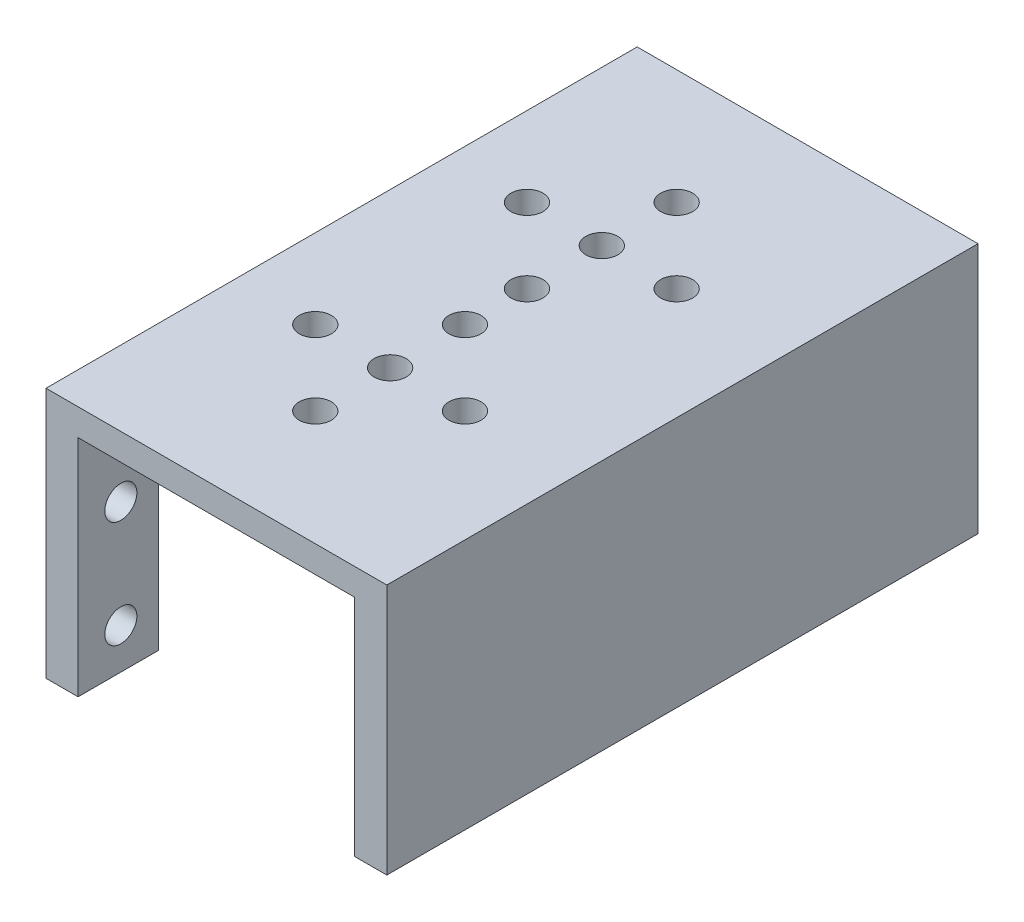
ISO-10303-21;
HEADER;
FILE_DESCRIPTION(('STEP AP214'),'2;1');
FILE_NAME('part.step','',(''),(''),'','','');
FILE_SCHEMA(('AUTOMOTIVE_DESIGN { 1 0 10303 214 1 1 1 1 }'));
ENDSEC;
DATA;
#1=APPLICATION_CONTEXT('core data for automotive mechanical design processes');
#2=APPLICATION_PROTOCOL_DEFINITION('international standard','automotive_design',2000,#1);
#3=PRODUCT_CONTEXT('',#1,'mechanical');
#4=PRODUCT('Part','Part','',(#3));
#5=PRODUCT_RELATED_PRODUCT_CATEGORY('part','',(#4));
#6=PRODUCT_DEFINITION_FORMATION('','',#4);
#7=PRODUCT_DEFINITION_CONTEXT('part definition',#1,'design');
#8=PRODUCT_DEFINITION('design','',#6,#7);
#9=PRODUCT_DEFINITION_SHAPE('','',#8);
#10=(LENGTH_UNIT() NAMED_UNIT(*) SI_UNIT(.MILLI.,.METRE.));
#11=(NAMED_UNIT(*) PLANE_ANGLE_UNIT() SI_UNIT($,.RADIAN.));
#12=(NAMED_UNIT(*) SI_UNIT($,.STERADIAN.) SOLID_ANGLE_UNIT());
#13=UNCERTAINTY_MEASURE_WITH_UNIT(LENGTH_MEASURE(1.E-05),#10,'distance_accuracy_value','');
#14=(GEOMETRIC_REPRESENTATION_CONTEXT(3) GLOBAL_UNCERTAINTY_ASSIGNED_CONTEXT((#13)) GLOBAL_UNIT_ASSIGNED_CONTEXT((#10,
#11,#12)) REPRESENTATION_CONTEXT('',''));
#15=CARTESIAN_POINT('',(0.,0.,0.));
#16=DIRECTION('',(0.,0.,1.));
#17=DIRECTION('',(1.,0.,0.));
#18=AXIS2_PLACEMENT_3D('',#15,#16,#17);
#19=CARTESIAN_POINT('',(0.,26.,-47.8));
#20=DIRECTION('',(0.,0.,-1.));
#21=DIRECTION('',(-1.,0.,0.));
#22=AXIS2_PLACEMENT_3D('',#19,#20,#21);
#23=PLANE('',#22);
#24=DIRECTION('',(1.,0.,0.));
#25=VECTOR('',#24,1.);
#26=CARTESIAN_POINT('',(0.,23.5,-47.8));
#27=LINE('',#26,#25);
#28=CARTESIAN_POINT('',(0.,23.5,-47.8));
#29=VERTEX_POINT('',#28);
#30=CARTESIAN_POINT('',(3.,23.5,-47.8));
#31=VERTEX_POINT('',#30);
#32=EDGE_CURVE('E267',#29,#31,#27,.T.);
#33=ORIENTED_EDGE('',*,*,#32,.F.);
#34=DIRECTION('',(0.,-1.,0.));
#35=VECTOR('',#34,1.);
#36=CARTESIAN_POINT('',(0.,26.,-47.8));
#37=LINE('',#36,#35);
#38=CARTESIAN_POINT('',(0.,2.5,-47.8));
#39=VERTEX_POINT('',#38);
#40=EDGE_CURVE('E301',#29,#39,#37,.T.);
#41=ORIENTED_EDGE('',*,*,#40,.T.);
#42=DIRECTION('',(1.,0.,0.));
#43=VECTOR('',#42,1.);
#44=CARTESIAN_POINT('',(0.,2.5,-47.8));
#45=LINE('',#44,#43);
#46=CARTESIAN_POINT('',(3.,2.5,-47.8));
#47=VERTEX_POINT('',#46);
#48=EDGE_CURVE('E66',#39,#47,#45,.T.);
#49=ORIENTED_EDGE('',*,*,#48,.T.);
#50=DIRECTION('',(0.,-1.,0.));
#51=VECTOR('',#50,1.);
#52=CARTESIAN_POINT('',(3.,26.,-47.8));
#53=LINE('',#52,#51);
#54=EDGE_CURVE('E298',#31,#47,#53,.T.);
#55=ORIENTED_EDGE('',*,*,#54,.F.);
#56=EDGE_LOOP('',(#33,#41,#49,#55));
#57=FACE_BOUND('',#56,.T.);
#58=ADVANCED_FACE('F43',(#57),#23,.F.);
#59=CARTESIAN_POINT('',(3.,26.,-55.3));
#60=DIRECTION('',(-1.,0.,0.));
#61=DIRECTION('',(0.,0.,1.));
#62=AXIS2_PLACEMENT_3D('',#59,#60,#61);
#63=PLANE('',#62);
#64=CARTESIAN_POINT('',(3.,16.3,-51.3));
#65=DIRECTION('',(-1.,0.,0.));
#66=DIRECTION('',(0.,0.,1.));
#67=AXIS2_PLACEMENT_3D('',#64,#65,#66);
#68=CIRCLE('',#67,1.5);
#69=CARTESIAN_POINT('',(3.,16.3,-49.8));
#70=VERTEX_POINT('',#69);
#71=EDGE_CURVE('E173',#70,#70,#68,.T.);
#72=ORIENTED_EDGE('',*,*,#71,.T.);
#73=EDGE_LOOP('',(#72));
#74=FACE_BOUND('',#73,.T.);
#75=CARTESIAN_POINT('',(3.,6.3,-51.3));
#76=DIRECTION('',(-1.,0.,0.));
#77=DIRECTION('',(0.,0.,1.));
#78=AXIS2_PLACEMENT_3D('',#75,#76,#77);
#79=CIRCLE('',#78,1.5);
#80=CARTESIAN_POINT('',(3.,6.3,-49.8));
#81=VERTEX_POINT('',#80);
#82=EDGE_CURVE('E187',#81,#81,#79,.T.);
#83=ORIENTED_EDGE('',*,*,#82,.T.);
#84=EDGE_LOOP('',(#83));
#85=FACE_BOUND('',#84,.T.);
#86=DIRECTION('',(0.,0.,-1.));
#87=VECTOR('',#86,1.);
#88=CARTESIAN_POINT('',(3.,23.5,-55.3));
#89=LINE('',#88,#87);
#90=CARTESIAN_POINT('',(3.,23.5,-55.3));
#91=VERTEX_POINT('',#90);
#92=EDGE_CURVE('E265',#31,#91,#89,.T.);
#93=ORIENTED_EDGE('',*,*,#92,.F.);
#94=ORIENTED_EDGE('',*,*,#54,.T.);
#95=DIRECTION('',(0.,0.,-1.));
#96=VECTOR('',#95,1.);
#97=CARTESIAN_POINT('',(3.,2.5,-55.3));
#98=LINE('',#97,#96);
#99=CARTESIAN_POINT('',(3.00000000000001,2.5,-55.3));
#100=VERTEX_POINT('',#99);
#101=EDGE_CURVE('E289',#47,#100,#98,.T.);
#102=ORIENTED_EDGE('',*,*,#101,.T.);
#103=DIRECTION('',(0.,-1.,0.));
#104=VECTOR('',#103,1.);
#105=CARTESIAN_POINT('',(3.,26.,-55.3));
#106=LINE('',#105,#104);
#107=EDGE_CURVE('E292',#91,#100,#106,.T.);
#108=ORIENTED_EDGE('',*,*,#107,.F.);
#109=EDGE_LOOP('',(#93,#94,#102,#108));
#110=FACE_BOUND('',#109,.T.);
#111=ADVANCED_FACE('F334',(#74,#85,#110),#63,.F.);
#112=CARTESIAN_POINT('',(3.,26.,0.));
#113=DIRECTION('',(-1.,0.,0.));
#114=DIRECTION('',(0.,0.,1.));
#115=AXIS2_PLACEMENT_3D('',#112,#113,#114);
#116=PLANE('',#115);
#117=CARTESIAN_POINT('',(3.,6.3,-4.));
#118=DIRECTION('',(-1.,0.,0.));
#119=DIRECTION('',(0.,0.,-1.));
#120=AXIS2_PLACEMENT_3D('',#117,#118,#119);
#121=CIRCLE('',#120,1.5);
#122=CARTESIAN_POINT('',(3.,6.3,-5.5));
#123=VERTEX_POINT('',#122);
#124=EDGE_CURVE('E167',#123,#123,#121,.T.);
#125=ORIENTED_EDGE('',*,*,#124,.T.);
#126=EDGE_LOOP('',(#125));
#127=FACE_BOUND('',#126,.T.);
#128=CARTESIAN_POINT('',(3.,16.3,-4.));
#129=DIRECTION('',(-1.,0.,0.));
#130=DIRECTION('',(0.,0.,-1.));
#131=AXIS2_PLACEMENT_3D('',#128,#129,#130);
#132=CIRCLE('',#131,1.5);
#133=CARTESIAN_POINT('',(3.,16.3,-5.5));
#134=VERTEX_POINT('',#133);
#135=EDGE_CURVE('E179',#134,#134,#132,.T.);
#136=ORIENTED_EDGE('',*,*,#135,.T.);
#137=EDGE_LOOP('',(#136));
#138=FACE_BOUND('',#137,.T.);
#139=DIRECTION('',(0.,0.,-1.));
#140=VECTOR('',#139,1.);
#141=CARTESIAN_POINT('',(3.,23.5,0.));
#142=LINE('',#141,#140);
#143=CARTESIAN_POINT('',(3.,23.5,0.));
#144=VERTEX_POINT('',#143);
#145=CARTESIAN_POINT('',(3.,23.5,-7.5));
#146=VERTEX_POINT('',#145);
#147=EDGE_CURVE('E263',#144,#146,#142,.T.);
#148=ORIENTED_EDGE('',*,*,#147,.F.);
#149=DIRECTION('',(0.,-1.,0.));
#150=VECTOR('',#149,1.);
#151=CARTESIAN_POINT('',(3.,26.,0.));
#152=LINE('',#151,#150);
#153=CARTESIAN_POINT('',(3.00000000000001,2.5,0.));
#154=VERTEX_POINT('',#153);
#155=EDGE_CURVE('E269',#144,#154,#152,.T.);
#156=ORIENTED_EDGE('',*,*,#155,.T.);
#157=DIRECTION('',(0.,0.,-1.));
#158=VECTOR('',#157,1.);
#159=CARTESIAN_POINT('',(3.,2.5,0.));
#160=LINE('',#159,#158);
#161=CARTESIAN_POINT('',(3.,2.5,-7.5));
#162=VERTEX_POINT('',#161);
#163=EDGE_CURVE('E282',#154,#162,#160,.T.);
#164=ORIENTED_EDGE('',*,*,#163,.T.);
#165=DIRECTION('',(0.,-1.,0.));
#166=VECTOR('',#165,1.);
#167=CARTESIAN_POINT('',(3.,26.,-7.5));
#168=LINE('',#167,#166);
#169=EDGE_CURVE('E272',#146,#162,#168,.T.);
#170=ORIENTED_EDGE('',*,*,#169,.F.);
#171=EDGE_LOOP('',(#148,#156,#164,#170));
#172=FACE_BOUND('',#171,.T.);
#173=ADVANCED_FACE('F344',(#127,#138,#172),#116,.F.);
#174=CARTESIAN_POINT('',(0.,26.,-7.5));
#175=DIRECTION('',(0.,0.,1.));
#176=DIRECTION('',(1.,0.,0.));
#177=AXIS2_PLACEMENT_3D('',#174,#175,#176);
#178=PLANE('',#177);
#179=DIRECTION('',(-1.,0.,0.));
#180=VECTOR('',#179,1.);
#181=CARTESIAN_POINT('',(0.,23.5,-7.5));
#182=LINE('',#181,#180);
#183=CARTESIAN_POINT('',(0.,23.5,-7.5));
#184=VERTEX_POINT('',#183);
#185=EDGE_CURVE('E11',#146,#184,#182,.T.);
#186=ORIENTED_EDGE('',*,*,#185,.F.);
#187=ORIENTED_EDGE('',*,*,#169,.T.);
#188=DIRECTION('',(-1.,0.,0.));
#189=VECTOR('',#188,1.);
#190=CARTESIAN_POINT('',(0.,2.5,-7.5));
#191=LINE('',#190,#189);
#192=CARTESIAN_POINT('',(0.,2.5,-7.5));
#193=VERTEX_POINT('',#192);
#194=EDGE_CURVE('E279',#162,#193,#191,.T.);
#195=ORIENTED_EDGE('',*,*,#194,.T.);
#196=DIRECTION('',(0.,-1.,0.));
#197=VECTOR('',#196,1.);
#198=CARTESIAN_POINT('',(0.,26.,-7.5));
#199=LINE('',#198,#197);
#200=EDGE_CURVE('E275',#184,#193,#199,.T.);
#201=ORIENTED_EDGE('',*,*,#200,.F.);
#202=EDGE_LOOP('',(#186,#187,#195,#201));
#203=FACE_BOUND('',#202,.T.);
#204=ADVANCED_FACE('F339',(#203),#178,.F.);
#205=CARTESIAN_POINT('',(28.88,3.,0.));
#206=DIRECTION('',(0.,0.,-1.));
#207=DIRECTION('',(-1.,0.,0.));
#208=AXIS2_PLACEMENT_3D('',#205,#206,#207);
#209=PLANE('',#208);
#210=DIRECTION('',(0.,-1.,0.));
#211=VECTOR('',#210,1.);
#212=CARTESIAN_POINT('',(0.,3.,0.));
#213=LINE('',#212,#211);
#214=CARTESIAN_POINT('',(0.,26.,0.));
#215=VERTEX_POINT('',#214);
#216=CARTESIAN_POINT('',(0.,2.5,0.));
#217=VERTEX_POINT('',#216);
#218=EDGE_CURVE('E304',#215,#217,#213,.T.);
#219=ORIENTED_EDGE('',*,*,#218,.T.);
#220=DIRECTION('',(-1.,0.,0.));
#221=VECTOR('',#220,1.);
#222=CARTESIAN_POINT('',(28.88,2.5,0.));
#223=LINE('',#222,#221);
#224=EDGE_CURVE('E58',#154,#217,#223,.T.);
#225=ORIENTED_EDGE('',*,*,#224,.F.);
#226=ORIENTED_EDGE('',*,*,#155,.F.);
#227=DIRECTION('',(1.,0.,0.));
#228=VECTOR('',#227,1.);
#229=CARTESIAN_POINT('',(0.,23.5,0.));
#230=LINE('',#229,#228);
#231=CARTESIAN_POINT('',(28.88,23.5,0.));
#232=VERTEX_POINT('',#231);
#233=EDGE_CURVE('E255',#144,#232,#230,.T.);
#234=ORIENTED_EDGE('',*,*,#233,.T.);
#235=DIRECTION('',(0.,-1.,0.));
#236=VECTOR('',#235,1.);
#237=CARTESIAN_POINT('',(28.88,26.,0.));
#238=LINE('',#237,#236);
#239=CARTESIAN_POINT('',(28.88,2.5,0.));
#240=VERTEX_POINT('',#239);
#241=EDGE_CURVE('E155',#232,#240,#238,.T.);
#242=ORIENTED_EDGE('',*,*,#241,.T.);
#243=DIRECTION('',(-1.,0.,0.));
#244=VECTOR('',#243,1.);
#245=CARTESIAN_POINT('',(31.88,2.5,0.));
#246=LINE('',#245,#244);
#247=CARTESIAN_POINT('',(31.88,2.5,0.));
#248=VERTEX_POINT('',#247);
#249=EDGE_CURVE('E135',#248,#240,#246,.T.);
#250=ORIENTED_EDGE('',*,*,#249,.F.);
#251=DIRECTION('',(0.,-1.,0.));
#252=VECTOR('',#251,1.);
#253=CARTESIAN_POINT('',(31.88,26.,0.));
#254=LINE('',#253,#252);
#255=CARTESIAN_POINT('',(31.88,26.,0.));
#256=VERTEX_POINT('',#255);
#257=EDGE_CURVE('E142',#256,#248,#254,.T.);
#258=ORIENTED_EDGE('',*,*,#257,.F.);
#259=DIRECTION('',(1.,0.,0.));
#260=VECTOR('',#259,1.);
#261=CARTESIAN_POINT('',(0.,26.,0.));
#262=LINE('',#261,#260);
#263=EDGE_CURVE('E278',#215,#256,#262,.T.);
#264=ORIENTED_EDGE('',*,*,#263,.F.);
#265=EDGE_LOOP('',(#219,#225,#226,#234,#242,#250,#258,#264));
#266=FACE_BOUND('',#265,.T.);
#267=ADVANCED_FACE('F45',(#266),#209,.F.);
#268=CARTESIAN_POINT('',(0.,3.,-55.3));
#269=DIRECTION('',(0.,0.,1.));
#270=DIRECTION('',(1.,0.,0.));
#271=AXIS2_PLACEMENT_3D('',#268,#269,#270);
#272=PLANE('',#271);
#273=ORIENTED_EDGE('',*,*,#107,.T.);
#274=DIRECTION('',(-1.,0.,0.));
#275=VECTOR('',#274,1.);
#276=CARTESIAN_POINT('',(28.88,2.5,-55.3));
#277=LINE('',#276,#275);
#278=CARTESIAN_POINT('',(0.,2.5,-55.3));
#279=VERTEX_POINT('',#278);
#280=EDGE_CURVE('E164',#100,#279,#277,.T.);
#281=ORIENTED_EDGE('',*,*,#280,.T.);
#282=DIRECTION('',(0.,-1.,0.));
#283=VECTOR('',#282,1.);
#284=CARTESIAN_POINT('',(0.,3.,-55.3));
#285=LINE('',#284,#283);
#286=CARTESIAN_POINT('',(0.,26.,-55.3));
#287=VERTEX_POINT('',#286);
#288=EDGE_CURVE('E51',#287,#279,#285,.T.);
#289=ORIENTED_EDGE('',*,*,#288,.F.);
#290=DIRECTION('',(-1.,0.,0.));
#291=VECTOR('',#290,1.);
#292=CARTESIAN_POINT('',(0.,26.,-55.3));
#293=LINE('',#292,#291);
#294=CARTESIAN_POINT('',(31.88,26.,-55.3));
#295=VERTEX_POINT('',#294);
#296=EDGE_CURVE('E288',#295,#287,#293,.T.);
#297=ORIENTED_EDGE('',*,*,#296,.F.);
#298=DIRECTION('',(0.,1.,0.));
#299=VECTOR('',#298,1.);
#300=CARTESIAN_POINT('',(31.88,26.,-55.3));
#301=LINE('',#300,#299);
#302=CARTESIAN_POINT('',(31.88,2.5,-55.3));
#303=VERTEX_POINT('',#302);
#304=EDGE_CURVE('E141',#303,#295,#301,.T.);
#305=ORIENTED_EDGE('',*,*,#304,.F.);
#306=DIRECTION('',(-1.,0.,0.));
#307=VECTOR('',#306,1.);
#308=CARTESIAN_POINT('',(31.88,2.5,-55.3));
#309=LINE('',#308,#307);
#310=CARTESIAN_POINT('',(28.88,2.5,-55.3));
#311=VERTEX_POINT('',#310);
#312=EDGE_CURVE('E137',#303,#311,#309,.T.);
#313=ORIENTED_EDGE('',*,*,#312,.T.);
#314=DIRECTION('',(0.,1.,0.));
#315=VECTOR('',#314,1.);
#316=CARTESIAN_POINT('',(28.88,26.,-55.3));
#317=LINE('',#316,#315);
#318=CARTESIAN_POINT('',(28.88,23.5,-55.3));
#319=VERTEX_POINT('',#318);
#320=EDGE_CURVE('E151',#311,#319,#317,.T.);
#321=ORIENTED_EDGE('',*,*,#320,.T.);
#322=DIRECTION('',(-1.,0.,0.));
#323=VECTOR('',#322,1.);
#324=CARTESIAN_POINT('',(0.,23.5,-55.3));
#325=LINE('',#324,#323);
#326=EDGE_CURVE('E260',#319,#91,#325,.T.);
#327=ORIENTED_EDGE('',*,*,#326,.T.);
#328=EDGE_LOOP('',(#273,#281,#289,#297,#305,#313,#321,#327));
#329=FACE_BOUND('',#328,.T.);
#330=ADVANCED_FACE('F312',(#329),#272,.F.);
#331=CARTESIAN_POINT('',(0.,3.,0.));
#332=DIRECTION('',(1.,0.,0.));
#333=DIRECTION('',(0.,0.,-1.));
#334=AXIS2_PLACEMENT_3D('',#331,#332,#333);
#335=PLANE('',#334);
#336=CARTESIAN_POINT('',(0.,6.3,-4.));
#337=DIRECTION('',(-1.,0.,0.));
#338=DIRECTION('',(0.,0.,-1.));
#339=AXIS2_PLACEMENT_3D('',#336,#337,#338);
#340=CIRCLE('',#339,1.5);
#341=CARTESIAN_POINT('',(0.,6.3,-5.5));
#342=VERTEX_POINT('',#341);
#343=EDGE_CURVE('E182',#342,#342,#340,.T.);
#344=ORIENTED_EDGE('',*,*,#343,.F.);
#345=EDGE_LOOP('',(#344));
#346=FACE_BOUND('',#345,.T.);
#347=CARTESIAN_POINT('',(0.,16.3,-4.));
#348=DIRECTION('',(-1.,0.,0.));
#349=DIRECTION('',(0.,0.,-1.));
#350=AXIS2_PLACEMENT_3D('',#347,#348,#349);
#351=CIRCLE('',#350,1.5);
#352=CARTESIAN_POINT('',(0.,16.3,-5.5));
#353=VERTEX_POINT('',#352);
#354=EDGE_CURVE('E176',#353,#353,#351,.T.);
#355=ORIENTED_EDGE('',*,*,#354,.F.);
#356=EDGE_LOOP('',(#355));
#357=FACE_BOUND('',#356,.T.);
#358=CARTESIAN_POINT('',(0.,16.3,-51.3));
#359=DIRECTION('',(-1.,0.,0.));
#360=DIRECTION('',(0.,0.,1.));
#361=AXIS2_PLACEMENT_3D('',#358,#359,#360);
#362=CIRCLE('',#361,1.5);
#363=CARTESIAN_POINT('',(0.,16.3,-49.8));
#364=VERTEX_POINT('',#363);
#365=EDGE_CURVE('E169',#364,#364,#362,.T.);
#366=ORIENTED_EDGE('',*,*,#365,.F.);
#367=EDGE_LOOP('',(#366));
#368=FACE_BOUND('',#367,.T.);
#369=CARTESIAN_POINT('',(0.,6.3,-51.3));
#370=DIRECTION('',(-1.,0.,0.));
#371=DIRECTION('',(0.,0.,1.));
#372=AXIS2_PLACEMENT_3D('',#369,#370,#371);
#373=CIRCLE('',#372,1.5);
#374=CARTESIAN_POINT('',(0.,6.3,-49.8));
#375=VERTEX_POINT('',#374);
#376=EDGE_CURVE('E172',#375,#375,#373,.T.);
#377=ORIENTED_EDGE('',*,*,#376,.F.);
#378=EDGE_LOOP('',(#377));
#379=FACE_BOUND('',#378,.T.);
#380=ORIENTED_EDGE('',*,*,#288,.T.);
#381=DIRECTION('',(0.,0.,-1.));
#382=VECTOR('',#381,1.);
#383=CARTESIAN_POINT('',(0.,2.5,-55.3));
#384=LINE('',#383,#382);
#385=EDGE_CURVE('E157',#39,#279,#384,.T.);
#386=ORIENTED_EDGE('',*,*,#385,.F.);
#387=ORIENTED_EDGE('',*,*,#40,.F.);
#388=DIRECTION('',(0.,0.,1.));
#389=VECTOR('',#388,1.);
#390=CARTESIAN_POINT('',(0.,23.5,-55.3));
#391=LINE('',#390,#389);
#392=EDGE_CURVE('E250',#29,#184,#391,.T.);
#393=ORIENTED_EDGE('',*,*,#392,.T.);
#394=ORIENTED_EDGE('',*,*,#200,.T.);
#395=EDGE_CURVE('E159',#217,#193,#384,.T.);
#396=ORIENTED_EDGE('',*,*,#395,.F.);
#397=ORIENTED_EDGE('',*,*,#218,.F.);
#398=DIRECTION('',(0.,0.,1.));
#399=VECTOR('',#398,1.);
#400=CARTESIAN_POINT('',(0.,26.,-55.3));
#401=LINE('',#400,#399);
#402=EDGE_CURVE('E286',#287,#215,#401,.T.);
#403=ORIENTED_EDGE('',*,*,#402,.F.);
#404=EDGE_LOOP('',(#380,#386,#387,#393,#394,#396,#397,#403));
#405=FACE_BOUND('',#404,.T.);
#406=ADVANCED_FACE('F308',(#346,#357,#368,#379,#405),#335,.F.);
#407=CARTESIAN_POINT('',(0.,26.,0.));
#408=DIRECTION('',(0.,1.,0.));
#409=DIRECTION('',(0.,0.,1.));
#410=AXIS2_PLACEMENT_3D('',#407,#408,#409);
#411=PLANE('',#410);
#412=ORIENTED_EDGE('',*,*,#402,.T.);
#413=ORIENTED_EDGE('',*,*,#263,.T.);
#414=DIRECTION('',(0.,0.,1.));
#415=VECTOR('',#414,1.);
#416=CARTESIAN_POINT('',(31.88,26.,0.));
#417=LINE('',#416,#415);
#418=EDGE_CURVE('E148',#295,#256,#417,.T.);
#419=ORIENTED_EDGE('',*,*,#418,.F.);
#420=ORIENTED_EDGE('',*,*,#296,.T.);
#421=EDGE_LOOP('',(#412,#413,#419,#420));
#422=FACE_BOUND('',#421,.T.);
#423=CARTESIAN_POINT('',(14.44,26.,-10.75));
#424=DIRECTION('',(0.,1.,0.));
#425=DIRECTION('',(0.,0.,1.));
#426=AXIS2_PLACEMENT_3D('',#423,#424,#425);
#427=CIRCLE('',#426,1.5);
#428=CARTESIAN_POINT('',(14.44,26.,-9.24999999999999));
#429=VERTEX_POINT('',#428);
#430=EDGE_CURVE('E190',#429,#429,#427,.T.);
#431=ORIENTED_EDGE('',*,*,#430,.F.);
#432=EDGE_LOOP('',(#431));
#433=FACE_BOUND('',#432,.T.);
#434=CARTESIAN_POINT('',(7.44,26.,-17.75));
#435=DIRECTION('',(0.,1.,0.));
#436=DIRECTION('',(0.,0.,1.));
#437=AXIS2_PLACEMENT_3D('',#434,#435,#436);
#438=CIRCLE('',#437,1.5);
#439=CARTESIAN_POINT('',(7.44,26.,-16.25));
#440=VERTEX_POINT('',#439);
#441=EDGE_CURVE('E196',#440,#440,#438,.T.);
#442=ORIENTED_EDGE('',*,*,#441,.F.);
#443=EDGE_LOOP('',(#442));
#444=FACE_BOUND('',#443,.T.);
#445=CARTESIAN_POINT('',(14.44,26.,-17.75));
#446=DIRECTION('',(0.,1.,0.));
#447=DIRECTION('',(0.,0.,1.));
#448=AXIS2_PLACEMENT_3D('',#445,#446,#447);
#449=CIRCLE('',#448,1.5);
#450=CARTESIAN_POINT('',(14.44,26.,-16.25));
#451=VERTEX_POINT('',#450);
#452=EDGE_CURVE('E202',#451,#451,#449,.T.);
#453=ORIENTED_EDGE('',*,*,#452,.F.);
#454=EDGE_LOOP('',(#453));
#455=FACE_BOUND('',#454,.T.);
#456=CARTESIAN_POINT('',(21.44,26.,-17.75));
#457=DIRECTION('',(0.,1.,0.));
#458=DIRECTION('',(0.,0.,1.));
#459=AXIS2_PLACEMENT_3D('',#456,#457,#458);
#460=CIRCLE('',#459,1.5);
#461=CARTESIAN_POINT('',(21.44,26.,-16.25));
#462=VERTEX_POINT('',#461);
#463=EDGE_CURVE('E208',#462,#462,#460,.T.);
#464=ORIENTED_EDGE('',*,*,#463,.F.);
#465=EDGE_LOOP('',(#464));
#466=FACE_BOUND('',#465,.T.);
#467=CARTESIAN_POINT('',(14.44,26.,-24.75));
#468=DIRECTION('',(0.,1.,0.));
#469=DIRECTION('',(0.,0.,1.));
#470=AXIS2_PLACEMENT_3D('',#467,#468,#469);
#471=CIRCLE('',#470,1.5);
#472=CARTESIAN_POINT('',(14.44,26.,-23.25));
#473=VERTEX_POINT('',#472);
#474=EDGE_CURVE('E214',#473,#473,#471,.T.);
#475=ORIENTED_EDGE('',*,*,#474,.F.);
#476=EDGE_LOOP('',(#475));
#477=FACE_BOUND('',#476,.T.);
#478=CARTESIAN_POINT('',(7.44,26.,-37.55));
#479=DIRECTION('',(0.,1.,0.));
#480=DIRECTION('',(0.,0.,1.));
#481=AXIS2_PLACEMENT_3D('',#478,#479,#480);
#482=CIRCLE('',#481,1.5);
#483=CARTESIAN_POINT('',(7.44,26.,-36.05));
#484=VERTEX_POINT('',#483);
#485=EDGE_CURVE('E220',#484,#484,#482,.T.);
#486=ORIENTED_EDGE('',*,*,#485,.F.);
#487=EDGE_LOOP('',(#486));
#488=FACE_BOUND('',#487,.T.);
#489=CARTESIAN_POINT('',(14.44,26.,-30.55));
#490=DIRECTION('',(0.,1.,0.));
#491=DIRECTION('',(0.,0.,1.));
#492=AXIS2_PLACEMENT_3D('',#489,#490,#491);
#493=CIRCLE('',#492,1.5);
#494=CARTESIAN_POINT('',(14.44,26.,-29.05));
#495=VERTEX_POINT('',#494);
#496=EDGE_CURVE('E226',#495,#495,#493,.T.);
#497=ORIENTED_EDGE('',*,*,#496,.F.);
#498=EDGE_LOOP('',(#497));
#499=FACE_BOUND('',#498,.T.);
#500=CARTESIAN_POINT('',(14.44,26.,-37.55));
#501=DIRECTION('',(0.,1.,0.));
#502=DIRECTION('',(0.,0.,1.));
#503=AXIS2_PLACEMENT_3D('',#500,#501,#502);
#504=CIRCLE('',#503,1.49999999999999);
#505=CARTESIAN_POINT('',(14.44,26.,-36.05));
#506=VERTEX_POINT('',#505);
#507=EDGE_CURVE('E232',#506,#506,#504,.T.);
#508=ORIENTED_EDGE('',*,*,#507,.F.);
#509=EDGE_LOOP('',(#508));
#510=FACE_BOUND('',#509,.T.);
#511=CARTESIAN_POINT('',(21.44,26.,-37.55));
#512=DIRECTION('',(0.,1.,0.));
#513=DIRECTION('',(0.,0.,1.));
#514=AXIS2_PLACEMENT_3D('',#511,#512,#513);
#515=CIRCLE('',#514,1.5);
#516=CARTESIAN_POINT('',(21.44,26.,-36.05));
#517=VERTEX_POINT('',#516);
#518=EDGE_CURVE('E238',#517,#517,#515,.T.);
#519=ORIENTED_EDGE('',*,*,#518,.F.);
#520=EDGE_LOOP('',(#519));
#521=FACE_BOUND('',#520,.T.);
#522=CARTESIAN_POINT('',(14.44,26.,-44.55));
#523=DIRECTION('',(0.,1.,0.));
#524=DIRECTION('',(0.,0.,1.));
#525=AXIS2_PLACEMENT_3D('',#522,#523,#524);
#526=CIRCLE('',#525,1.49999999999999);
#527=CARTESIAN_POINT('',(14.44,26.,-43.05));
#528=VERTEX_POINT('',#527);
#529=EDGE_CURVE('E244',#528,#528,#526,.T.);
#530=ORIENTED_EDGE('',*,*,#529,.F.);
#531=EDGE_LOOP('',(#530));
#532=FACE_BOUND('',#531,.T.);
#533=ADVANCED_FACE('F314',(#422,#433,#444,#455,#466,#477,#488,#499,#510,#521,#532),#411,.T.);
#534=CARTESIAN_POINT('',(0.,23.5,0.));
#535=DIRECTION('',(0.,1.,0.));
#536=DIRECTION('',(0.,0.,1.));
#537=AXIS2_PLACEMENT_3D('',#534,#535,#536);
#538=PLANE('',#537);
#539=CARTESIAN_POINT('',(14.44,23.5,-10.75));
#540=DIRECTION('',(0.,1.,0.));
#541=DIRECTION('',(0.,0.,1.));
#542=AXIS2_PLACEMENT_3D('',#539,#540,#541);
#543=CIRCLE('',#542,1.5);
#544=CARTESIAN_POINT('',(14.44,23.5,-9.24999999999999));
#545=VERTEX_POINT('',#544);
#546=EDGE_CURVE('E193',#545,#545,#543,.T.);
#547=ORIENTED_EDGE('',*,*,#546,.T.);
#548=EDGE_LOOP('',(#547));
#549=FACE_BOUND('',#548,.T.);
#550=CARTESIAN_POINT('',(7.44,23.5,-17.75));
#551=DIRECTION('',(0.,1.,0.));
#552=DIRECTION('',(0.,0.,1.));
#553=AXIS2_PLACEMENT_3D('',#550,#551,#552);
#554=CIRCLE('',#553,1.5);
#555=CARTESIAN_POINT('',(7.44,23.5,-16.25));
#556=VERTEX_POINT('',#555);
#557=EDGE_CURVE('E199',#556,#556,#554,.T.);
#558=ORIENTED_EDGE('',*,*,#557,.T.);
#559=EDGE_LOOP('',(#558));
#560=FACE_BOUND('',#559,.T.);
#561=CARTESIAN_POINT('',(14.44,23.5,-17.75));
#562=DIRECTION('',(0.,1.,0.));
#563=DIRECTION('',(0.,0.,1.));
#564=AXIS2_PLACEMENT_3D('',#561,#562,#563);
#565=CIRCLE('',#564,1.5);
#566=CARTESIAN_POINT('',(14.44,23.5,-16.25));
#567=VERTEX_POINT('',#566);
#568=EDGE_CURVE('E205',#567,#567,#565,.T.);
#569=ORIENTED_EDGE('',*,*,#568,.T.);
#570=EDGE_LOOP('',(#569));
#571=FACE_BOUND('',#570,.T.);
#572=CARTESIAN_POINT('',(21.44,23.5,-17.75));
#573=DIRECTION('',(0.,1.,0.));
#574=DIRECTION('',(0.,0.,1.));
#575=AXIS2_PLACEMENT_3D('',#572,#573,#574);
#576=CIRCLE('',#575,1.5);
#577=CARTESIAN_POINT('',(21.44,23.5,-16.25));
#578=VERTEX_POINT('',#577);
#579=EDGE_CURVE('E211',#578,#578,#576,.T.);
#580=ORIENTED_EDGE('',*,*,#579,.T.);
#581=EDGE_LOOP('',(#580));
#582=FACE_BOUND('',#581,.T.);
#583=CARTESIAN_POINT('',(14.44,23.5,-24.75));
#584=DIRECTION('',(0.,1.,0.));
#585=DIRECTION('',(0.,0.,1.));
#586=AXIS2_PLACEMENT_3D('',#583,#584,#585);
#587=CIRCLE('',#586,1.5);
#588=CARTESIAN_POINT('',(14.44,23.5,-23.25));
#589=VERTEX_POINT('',#588);
#590=EDGE_CURVE('E217',#589,#589,#587,.T.);
#591=ORIENTED_EDGE('',*,*,#590,.T.);
#592=EDGE_LOOP('',(#591));
#593=FACE_BOUND('',#592,.T.);
#594=CARTESIAN_POINT('',(7.44,23.5,-37.55));
#595=DIRECTION('',(0.,1.,0.));
#596=DIRECTION('',(0.,0.,1.));
#597=AXIS2_PLACEMENT_3D('',#594,#595,#596);
#598=CIRCLE('',#597,1.5);
#599=CARTESIAN_POINT('',(7.44,23.5,-36.05));
#600=VERTEX_POINT('',#599);
#601=EDGE_CURVE('E223',#600,#600,#598,.T.);
#602=ORIENTED_EDGE('',*,*,#601,.T.);
#603=EDGE_LOOP('',(#602));
#604=FACE_BOUND('',#603,.T.);
#605=CARTESIAN_POINT('',(14.44,23.5,-30.55));
#606=DIRECTION('',(0.,1.,0.));
#607=DIRECTION('',(0.,0.,1.));
#608=AXIS2_PLACEMENT_3D('',#605,#606,#607);
#609=CIRCLE('',#608,1.5);
#610=CARTESIAN_POINT('',(14.44,23.5,-29.05));
#611=VERTEX_POINT('',#610);
#612=EDGE_CURVE('E229',#611,#611,#609,.T.);
#613=ORIENTED_EDGE('',*,*,#612,.T.);
#614=EDGE_LOOP('',(#613));
#615=FACE_BOUND('',#614,.T.);
#616=CARTESIAN_POINT('',(14.44,23.5,-37.55));
#617=DIRECTION('',(0.,1.,0.));
#618=DIRECTION('',(0.,0.,1.));
#619=AXIS2_PLACEMENT_3D('',#616,#617,#618);
#620=CIRCLE('',#619,1.49999999999999);
#621=CARTESIAN_POINT('',(14.44,23.5,-36.05));
#622=VERTEX_POINT('',#621);
#623=EDGE_CURVE('E235',#622,#622,#620,.T.);
#624=ORIENTED_EDGE('',*,*,#623,.T.);
#625=EDGE_LOOP('',(#624));
#626=FACE_BOUND('',#625,.T.);
#627=CARTESIAN_POINT('',(21.44,23.5,-37.55));
#628=DIRECTION('',(0.,1.,0.));
#629=DIRECTION('',(0.,0.,1.));
#630=AXIS2_PLACEMENT_3D('',#627,#628,#629);
#631=CIRCLE('',#630,1.5);
#632=CARTESIAN_POINT('',(21.44,23.5,-36.05));
#633=VERTEX_POINT('',#632);
#634=EDGE_CURVE('E241',#633,#633,#631,.T.);
#635=ORIENTED_EDGE('',*,*,#634,.T.);
#636=EDGE_LOOP('',(#635));
#637=FACE_BOUND('',#636,.T.);
#638=CARTESIAN_POINT('',(14.44,23.5,-44.55));
#639=DIRECTION('',(0.,1.,0.));
#640=DIRECTION('',(0.,0.,1.));
#641=AXIS2_PLACEMENT_3D('',#638,#639,#640);
#642=CIRCLE('',#641,1.49999999999999);
#643=CARTESIAN_POINT('',(14.44,23.5,-43.05));
#644=VERTEX_POINT('',#643);
#645=EDGE_CURVE('E247',#644,#644,#642,.T.);
#646=ORIENTED_EDGE('',*,*,#645,.T.);
#647=EDGE_LOOP('',(#646));
#648=FACE_BOUND('',#647,.T.);
#649=ORIENTED_EDGE('',*,*,#392,.F.);
#650=ORIENTED_EDGE('',*,*,#32,.T.);
#651=ORIENTED_EDGE('',*,*,#92,.T.);
#652=ORIENTED_EDGE('',*,*,#326,.F.);
#653=DIRECTION('',(0.,0.,-1.));
#654=VECTOR('',#653,1.);
#655=CARTESIAN_POINT('',(28.88,23.5,-55.3));
#656=LINE('',#655,#654);
#657=EDGE_CURVE('E257',#232,#319,#656,.T.);
#658=ORIENTED_EDGE('',*,*,#657,.F.);
#659=ORIENTED_EDGE('',*,*,#233,.F.);
#660=ORIENTED_EDGE('',*,*,#147,.T.);
#661=ORIENTED_EDGE('',*,*,#185,.T.);
#662=EDGE_LOOP('',(#649,#650,#651,#652,#658,#659,#660,#661));
#663=FACE_BOUND('',#662,.T.);
#664=ADVANCED_FACE('F328',(#549,#560,#571,#582,#593,#604,#615,#626,#637,#648,#663),#538,.F.);
#665=CARTESIAN_POINT('',(14.44,23.5,-44.55));
#666=DIRECTION('',(0.,1.,0.));
#667=DIRECTION('',(0.,0.,1.));
#668=AXIS2_PLACEMENT_3D('',#665,#666,#667);
#669=CYLINDRICAL_SURFACE('',#668,1.49999999999999);
#670=ORIENTED_EDGE('',*,*,#645,.F.);
#671=EDGE_LOOP('',(#670));
#672=FACE_BOUND('',#671,.T.);
#673=ORIENTED_EDGE('',*,*,#529,.T.);
#674=EDGE_LOOP('',(#673));
#675=FACE_BOUND('',#674,.T.);
#676=ADVANCED_FACE('F429',(#672,#675),#669,.F.);
#677=CARTESIAN_POINT('',(21.44,23.5,-37.55));
#678=DIRECTION('',(0.,1.,0.));
#679=DIRECTION('',(0.,0.,1.));
#680=AXIS2_PLACEMENT_3D('',#677,#678,#679);
#681=CYLINDRICAL_SURFACE('',#680,1.5);
#682=ORIENTED_EDGE('',*,*,#634,.F.);
#683=EDGE_LOOP('',(#682));
#684=FACE_BOUND('',#683,.T.);
#685=ORIENTED_EDGE('',*,*,#518,.T.);
#686=EDGE_LOOP('',(#685));
#687=FACE_BOUND('',#686,.T.);
#688=ADVANCED_FACE('F437',(#684,#687),#681,.F.);
#689=CARTESIAN_POINT('',(14.44,23.5,-37.55));
#690=DIRECTION('',(0.,1.,0.));
#691=DIRECTION('',(0.,0.,1.));
#692=AXIS2_PLACEMENT_3D('',#689,#690,#691);
#693=CYLINDRICAL_SURFACE('',#692,1.49999999999999);
#694=ORIENTED_EDGE('',*,*,#623,.F.);
#695=EDGE_LOOP('',(#694));
#696=FACE_BOUND('',#695,.T.);
#697=ORIENTED_EDGE('',*,*,#507,.T.);
#698=EDGE_LOOP('',(#697));
#699=FACE_BOUND('',#698,.T.);
#700=ADVANCED_FACE('F446',(#696,#699),#693,.F.);
#701=CARTESIAN_POINT('',(14.44,23.5,-30.55));
#702=DIRECTION('',(0.,1.,0.));
#703=DIRECTION('',(0.,0.,1.));
#704=AXIS2_PLACEMENT_3D('',#701,#702,#703);
#705=CYLINDRICAL_SURFACE('',#704,1.5);
#706=ORIENTED_EDGE('',*,*,#612,.F.);
#707=EDGE_LOOP('',(#706));
#708=FACE_BOUND('',#707,.T.);
#709=ORIENTED_EDGE('',*,*,#496,.T.);
#710=EDGE_LOOP('',(#709));
#711=FACE_BOUND('',#710,.T.);
#712=ADVANCED_FACE('F455',(#708,#711),#705,.F.);
#713=CARTESIAN_POINT('',(7.44,23.5,-37.55));
#714=DIRECTION('',(0.,1.,0.));
#715=DIRECTION('',(0.,0.,1.));
#716=AXIS2_PLACEMENT_3D('',#713,#714,#715);
#717=CYLINDRICAL_SURFACE('',#716,1.5);
#718=ORIENTED_EDGE('',*,*,#601,.F.);
#719=EDGE_LOOP('',(#718));
#720=FACE_BOUND('',#719,.T.);
#721=ORIENTED_EDGE('',*,*,#485,.T.);
#722=EDGE_LOOP('',(#721));
#723=FACE_BOUND('',#722,.T.);
#724=ADVANCED_FACE('F464',(#720,#723),#717,.F.);
#725=CARTESIAN_POINT('',(14.44,23.5,-24.75));
#726=DIRECTION('',(0.,1.,0.));
#727=DIRECTION('',(0.,0.,1.));
#728=AXIS2_PLACEMENT_3D('',#725,#726,#727);
#729=CYLINDRICAL_SURFACE('',#728,1.5);
#730=ORIENTED_EDGE('',*,*,#590,.F.);
#731=EDGE_LOOP('',(#730));
#732=FACE_BOUND('',#731,.T.);
#733=ORIENTED_EDGE('',*,*,#474,.T.);
#734=EDGE_LOOP('',(#733));
#735=FACE_BOUND('',#734,.T.);
#736=ADVANCED_FACE('F473',(#732,#735),#729,.F.);
#737=CARTESIAN_POINT('',(21.44,23.5,-17.75));
#738=DIRECTION('',(0.,1.,0.));
#739=DIRECTION('',(0.,0.,1.));
#740=AXIS2_PLACEMENT_3D('',#737,#738,#739);
#741=CYLINDRICAL_SURFACE('',#740,1.5);
#742=ORIENTED_EDGE('',*,*,#579,.F.);
#743=EDGE_LOOP('',(#742));
#744=FACE_BOUND('',#743,.T.);
#745=ORIENTED_EDGE('',*,*,#463,.T.);
#746=EDGE_LOOP('',(#745));
#747=FACE_BOUND('',#746,.T.);
#748=ADVANCED_FACE('F482',(#744,#747),#741,.F.);
#749=CARTESIAN_POINT('',(14.44,23.5,-17.75));
#750=DIRECTION('',(0.,1.,0.));
#751=DIRECTION('',(0.,0.,1.));
#752=AXIS2_PLACEMENT_3D('',#749,#750,#751);
#753=CYLINDRICAL_SURFACE('',#752,1.5);
#754=ORIENTED_EDGE('',*,*,#568,.F.);
#755=EDGE_LOOP('',(#754));
#756=FACE_BOUND('',#755,.T.);
#757=ORIENTED_EDGE('',*,*,#452,.T.);
#758=EDGE_LOOP('',(#757));
#759=FACE_BOUND('',#758,.T.);
#760=ADVANCED_FACE('F491',(#756,#759),#753,.F.);
#761=CARTESIAN_POINT('',(7.44,23.5,-17.75));
#762=DIRECTION('',(0.,1.,0.));
#763=DIRECTION('',(0.,0.,1.));
#764=AXIS2_PLACEMENT_3D('',#761,#762,#763);
#765=CYLINDRICAL_SURFACE('',#764,1.5);
#766=ORIENTED_EDGE('',*,*,#557,.F.);
#767=EDGE_LOOP('',(#766));
#768=FACE_BOUND('',#767,.T.);
#769=ORIENTED_EDGE('',*,*,#441,.T.);
#770=EDGE_LOOP('',(#769));
#771=FACE_BOUND('',#770,.T.);
#772=ADVANCED_FACE('F500',(#768,#771),#765,.F.);
#773=CARTESIAN_POINT('',(14.44,23.5,-10.75));
#774=DIRECTION('',(0.,1.,0.));
#775=DIRECTION('',(0.,0.,1.));
#776=AXIS2_PLACEMENT_3D('',#773,#774,#775);
#777=CYLINDRICAL_SURFACE('',#776,1.5);
#778=ORIENTED_EDGE('',*,*,#546,.F.);
#779=EDGE_LOOP('',(#778));
#780=FACE_BOUND('',#779,.T.);
#781=ORIENTED_EDGE('',*,*,#430,.T.);
#782=EDGE_LOOP('',(#781));
#783=FACE_BOUND('',#782,.T.);
#784=ADVANCED_FACE('F509',(#780,#783),#777,.F.);
#785=CARTESIAN_POINT('',(3.,6.3,-51.3));
#786=DIRECTION('',(-1.,0.,0.));
#787=DIRECTION('',(0.,0.,1.));
#788=AXIS2_PLACEMENT_3D('',#785,#786,#787);
#789=CYLINDRICAL_SURFACE('',#788,1.5);
#790=ORIENTED_EDGE('',*,*,#82,.F.);
#791=EDGE_LOOP('',(#790));
#792=FACE_BOUND('',#791,.T.);
#793=ORIENTED_EDGE('',*,*,#376,.T.);
#794=EDGE_LOOP('',(#793));
#795=FACE_BOUND('',#794,.T.);
#796=ADVANCED_FACE('F518',(#792,#795),#789,.F.);
#797=CARTESIAN_POINT('',(3.,16.3,-51.3));
#798=DIRECTION('',(-1.,0.,0.));
#799=DIRECTION('',(0.,0.,1.));
#800=AXIS2_PLACEMENT_3D('',#797,#798,#799);
#801=CYLINDRICAL_SURFACE('',#800,1.5);
#802=ORIENTED_EDGE('',*,*,#71,.F.);
#803=EDGE_LOOP('',(#802));
#804=FACE_BOUND('',#803,.T.);
#805=ORIENTED_EDGE('',*,*,#365,.T.);
#806=EDGE_LOOP('',(#805));
#807=FACE_BOUND('',#806,.T.);
#808=ADVANCED_FACE('F527',(#804,#807),#801,.F.);
#809=CARTESIAN_POINT('',(3.,16.3,-4.));
#810=DIRECTION('',(-1.,0.,0.));
#811=DIRECTION('',(0.,0.,1.));
#812=AXIS2_PLACEMENT_3D('',#809,#810,#811);
#813=CYLINDRICAL_SURFACE('',#812,1.5);
#814=ORIENTED_EDGE('',*,*,#135,.F.);
#815=EDGE_LOOP('',(#814));
#816=FACE_BOUND('',#815,.T.);
#817=ORIENTED_EDGE('',*,*,#354,.T.);
#818=EDGE_LOOP('',(#817));
#819=FACE_BOUND('',#818,.T.);
#820=ADVANCED_FACE('F536',(#816,#819),#813,.F.);
#821=CARTESIAN_POINT('',(3.,6.3,-4.));
#822=DIRECTION('',(-1.,0.,0.));
#823=DIRECTION('',(0.,0.,1.));
#824=AXIS2_PLACEMENT_3D('',#821,#822,#823);
#825=CYLINDRICAL_SURFACE('',#824,1.5);
#826=ORIENTED_EDGE('',*,*,#124,.F.);
#827=EDGE_LOOP('',(#826));
#828=FACE_BOUND('',#827,.T.);
#829=ORIENTED_EDGE('',*,*,#343,.T.);
#830=EDGE_LOOP('',(#829));
#831=FACE_BOUND('',#830,.T.);
#832=ADVANCED_FACE('F387',(#828,#831),#825,.F.);
#833=CARTESIAN_POINT('',(28.88,2.5,-55.3));
#834=DIRECTION('',(0.,1.,0.));
#835=DIRECTION('',(0.,0.,1.));
#836=AXIS2_PLACEMENT_3D('',#833,#834,#835);
#837=PLANE('',#836);
#838=ORIENTED_EDGE('',*,*,#224,.T.);
#839=ORIENTED_EDGE('',*,*,#395,.T.);
#840=ORIENTED_EDGE('',*,*,#194,.F.);
#841=ORIENTED_EDGE('',*,*,#163,.F.);
#842=EDGE_LOOP('',(#838,#839,#840,#841));
#843=FACE_BOUND('',#842,.T.);
#844=ADVANCED_FACE('F341',(#843),#837,.F.);
#845=ORIENTED_EDGE('',*,*,#385,.T.);
#846=ORIENTED_EDGE('',*,*,#280,.F.);
#847=ORIENTED_EDGE('',*,*,#101,.F.);
#848=ORIENTED_EDGE('',*,*,#48,.F.);
#849=EDGE_LOOP('',(#845,#846,#847,#848));
#850=FACE_BOUND('',#849,.T.);
#851=ADVANCED_FACE('F378',(#850),#837,.F.);
#852=CARTESIAN_POINT('',(28.88,0.,0.));
#853=DIRECTION('',(1.,0.,0.));
#854=DIRECTION('',(0.,0.,-1.));
#855=AXIS2_PLACEMENT_3D('',#852,#853,#854);
#856=PLANE('',#855);
#857=ORIENTED_EDGE('',*,*,#241,.F.);
#858=ORIENTED_EDGE('',*,*,#657,.T.);
#859=ORIENTED_EDGE('',*,*,#320,.F.);
#860=DIRECTION('',(0.,0.,-1.));
#861=VECTOR('',#860,1.);
#862=CARTESIAN_POINT('',(28.88,2.5,0.));
#863=LINE('',#862,#861);
#864=EDGE_CURVE('E320',#240,#311,#863,.T.);
#865=ORIENTED_EDGE('',*,*,#864,.F.);
#866=EDGE_LOOP('',(#857,#858,#859,#865));
#867=FACE_BOUND('',#866,.T.);
#868=ADVANCED_FACE('F325',(#867),#856,.F.);
#869=CARTESIAN_POINT('',(31.88,2.5,0.));
#870=DIRECTION('',(0.,1.,0.));
#871=DIRECTION('',(0.,0.,1.));
#872=AXIS2_PLACEMENT_3D('',#869,#870,#871);
#873=PLANE('',#872);
#874=ORIENTED_EDGE('',*,*,#864,.T.);
#875=ORIENTED_EDGE('',*,*,#312,.F.);
#876=DIRECTION('',(0.,0.,-1.));
#877=VECTOR('',#876,1.);
#878=CARTESIAN_POINT('',(31.88,2.5,0.));
#879=LINE('',#878,#877);
#880=EDGE_CURVE('E131',#248,#303,#879,.T.);
#881=ORIENTED_EDGE('',*,*,#880,.F.);
#882=ORIENTED_EDGE('',*,*,#249,.T.);
#883=EDGE_LOOP('',(#874,#875,#881,#882));
#884=FACE_BOUND('',#883,.T.);
#885=ADVANCED_FACE('F133',(#884),#873,.F.);
#886=CARTESIAN_POINT('',(31.88,0.,0.));
#887=DIRECTION('',(1.,0.,0.));
#888=DIRECTION('',(0.,0.,-1.));
#889=AXIS2_PLACEMENT_3D('',#886,#887,#888);
#890=PLANE('',#889);
#891=ORIENTED_EDGE('',*,*,#257,.T.);
#892=ORIENTED_EDGE('',*,*,#880,.T.);
#893=ORIENTED_EDGE('',*,*,#304,.T.);
#894=ORIENTED_EDGE('',*,*,#418,.T.);
#895=EDGE_LOOP('',(#891,#892,#893,#894));
#896=FACE_BOUND('',#895,.T.);
#897=ADVANCED_FACE('F146',(#896),#890,.T.);
#898=CLOSED_SHELL('',(#58,#111,#173,#204,#267,#330,#406,#533,#664,#676,#688,#700,#712,#724,#736,
#748,#760,#772,#784,#796,#808,#820,#832,#844,#851,#868,#885,#897));
#899=MANIFOLD_SOLID_BREP('B2',#898);
#900=ADVANCED_BREP_SHAPE_REPRESENTATION('',(#18,#899),#14);
#901=SHAPE_DEFINITION_REPRESENTATION(#9,#900);
ENDSEC;
END-ISO-10303-21;
